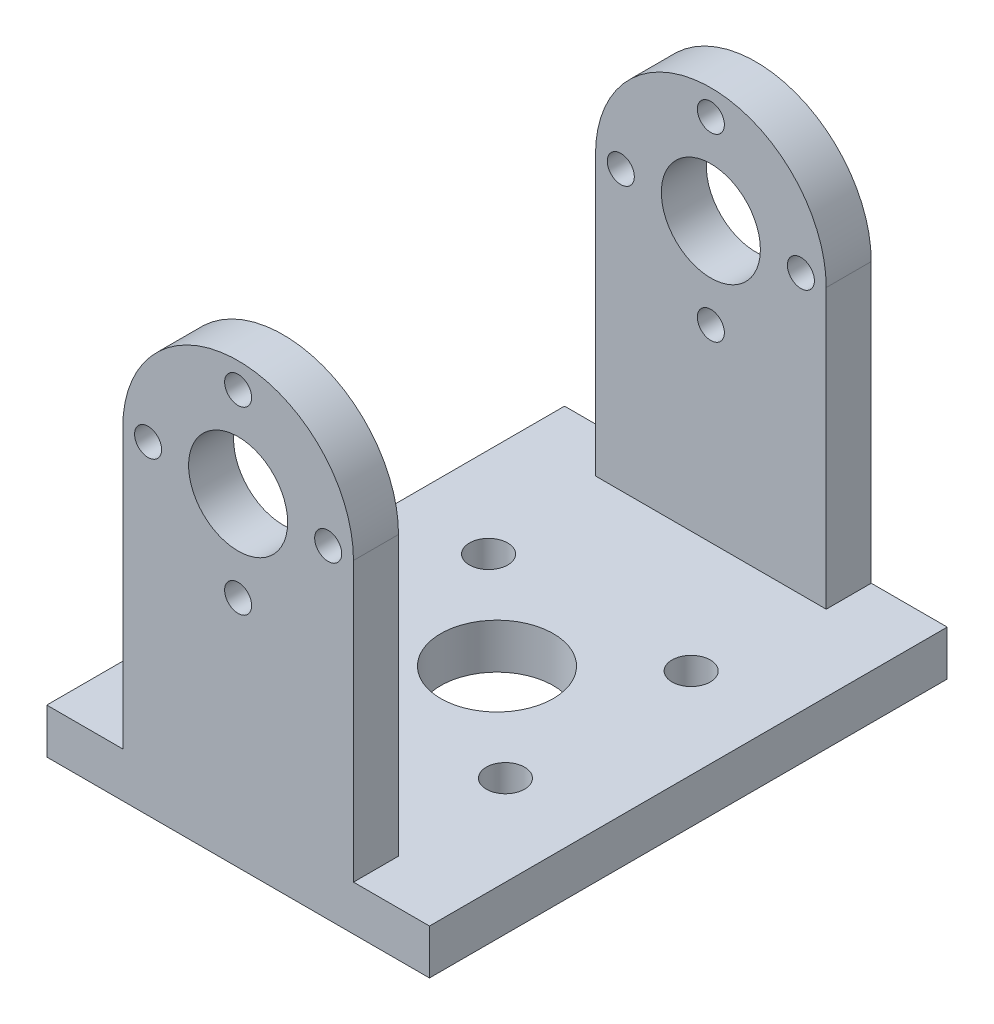
ISO-10303-21;
HEADER;
FILE_DESCRIPTION(('STEP AP214'),'2;1');
FILE_NAME('part.step','',(''),(''),'','','');
FILE_SCHEMA(('AUTOMOTIVE_DESIGN { 1 0 10303 214 1 1 1 1 }'));
ENDSEC;
DATA;
#1=APPLICATION_CONTEXT('core data for automotive mechanical design processes');
#2=APPLICATION_PROTOCOL_DEFINITION('international standard','automotive_design',2000,#1);
#3=PRODUCT_CONTEXT('',#1,'mechanical');
#4=PRODUCT('Part','Part','',(#3));
#5=PRODUCT_RELATED_PRODUCT_CATEGORY('part','',(#4));
#6=PRODUCT_DEFINITION_FORMATION('','',#4);
#7=PRODUCT_DEFINITION_CONTEXT('part definition',#1,'design');
#8=PRODUCT_DEFINITION('design','',#6,#7);
#9=PRODUCT_DEFINITION_SHAPE('','',#8);
#10=(LENGTH_UNIT() NAMED_UNIT(*) SI_UNIT(.MILLI.,.METRE.));
#11=(NAMED_UNIT(*) PLANE_ANGLE_UNIT() SI_UNIT($,.RADIAN.));
#12=(NAMED_UNIT(*) SI_UNIT($,.STERADIAN.) SOLID_ANGLE_UNIT());
#13=UNCERTAINTY_MEASURE_WITH_UNIT(LENGTH_MEASURE(1.E-05),#10,'distance_accuracy_value','');
#14=(GEOMETRIC_REPRESENTATION_CONTEXT(3) GLOBAL_UNCERTAINTY_ASSIGNED_CONTEXT((#13)) GLOBAL_UNIT_ASSIGNED_CONTEXT((#10,
#11,#12)) REPRESENTATION_CONTEXT('',''));
#15=CARTESIAN_POINT('',(0.,0.,0.));
#16=DIRECTION('',(0.,0.,1.));
#17=DIRECTION('',(1.,0.,0.));
#18=AXIS2_PLACEMENT_3D('',#15,#16,#17);
#19=CARTESIAN_POINT('',(0.,-24.75,0.));
#20=DIRECTION('',(0.,-1.,0.));
#21=DIRECTION('',(1.,0.,0.));
#22=AXIS2_PLACEMENT_3D('',#19,#20,#21);
#23=PLANE('',#22);
#24=CARTESIAN_POINT('',(0.,-24.75,23.));
#25=DIRECTION('',(0.,-1.,0.));
#26=DIRECTION('',(1.,0.,0.));
#27=AXIS2_PLACEMENT_3D('',#24,#25,#26);
#28=CIRCLE('',#27,5.);
#29=CARTESIAN_POINT('',(5.,-24.75,23.));
#30=VERTEX_POINT('',#29);
#31=EDGE_CURVE('E227',#30,#30,#28,.T.);
#32=ORIENTED_EDGE('',*,*,#31,.T.);
#33=EDGE_LOOP('',(#32));
#34=FACE_BOUND('',#33,.T.);
#35=CARTESIAN_POINT('',(9.,-24.75,14.75));
#36=DIRECTION('',(0.,-1.,0.));
#37=DIRECTION('',(1.,0.,0.));
#38=AXIS2_PLACEMENT_3D('',#35,#36,#37);
#39=CIRCLE('',#38,1.7);
#40=CARTESIAN_POINT('',(10.7,-24.75,14.75));
#41=VERTEX_POINT('',#40);
#42=EDGE_CURVE('E219',#41,#41,#39,.T.);
#43=ORIENTED_EDGE('',*,*,#42,.T.);
#44=EDGE_LOOP('',(#43));
#45=FACE_BOUND('',#44,.T.);
#46=CARTESIAN_POINT('',(-9.,-24.75,14.75));
#47=DIRECTION('',(0.,-1.,0.));
#48=DIRECTION('',(1.,0.,0.));
#49=AXIS2_PLACEMENT_3D('',#46,#47,#48);
#50=CIRCLE('',#49,1.7);
#51=CARTESIAN_POINT('',(-7.3,-24.75,14.75));
#52=VERTEX_POINT('',#51);
#53=EDGE_CURVE('E211',#52,#52,#50,.T.);
#54=ORIENTED_EDGE('',*,*,#53,.T.);
#55=EDGE_LOOP('',(#54));
#56=FACE_BOUND('',#55,.T.);
#57=CARTESIAN_POINT('',(-9.00000000000017,-24.75,31.25));
#58=DIRECTION('',(0.,-1.,0.));
#59=DIRECTION('',(1.,0.,0.));
#60=AXIS2_PLACEMENT_3D('',#57,#58,#59);
#61=CIRCLE('',#60,1.7);
#62=CARTESIAN_POINT('',(-7.30000000000017,-24.75,31.25));
#63=VERTEX_POINT('',#62);
#64=EDGE_CURVE('E203',#63,#63,#61,.T.);
#65=ORIENTED_EDGE('',*,*,#64,.T.);
#66=EDGE_LOOP('',(#65));
#67=FACE_BOUND('',#66,.T.);
#68=CARTESIAN_POINT('',(8.99999999999983,-24.75,31.25));
#69=DIRECTION('',(0.,-1.,0.));
#70=DIRECTION('',(1.,0.,0.));
#71=AXIS2_PLACEMENT_3D('',#68,#69,#70);
#72=CIRCLE('',#71,1.7);
#73=CARTESIAN_POINT('',(10.6999999999998,-24.75,31.25));
#74=VERTEX_POINT('',#73);
#75=EDGE_CURVE('E195',#74,#74,#72,.T.);
#76=ORIENTED_EDGE('',*,*,#75,.T.);
#77=EDGE_LOOP('',(#76));
#78=FACE_BOUND('',#77,.T.);
#79=DIRECTION('',(0.,0.,-1.));
#80=VECTOR('',#79,1.);
#81=CARTESIAN_POINT('',(10.25,-24.75,0.));
#82=LINE('',#81,#80);
#83=CARTESIAN_POINT('',(10.25,-24.75,46.));
#84=VERTEX_POINT('',#83);
#85=CARTESIAN_POINT('',(10.25,-24.75,42.));
#86=VERTEX_POINT('',#85);
#87=EDGE_CURVE('E11',#84,#86,#82,.T.);
#88=ORIENTED_EDGE('',*,*,#87,.F.);
#89=DIRECTION('',(-1.,0.,0.));
#90=VECTOR('',#89,1.);
#91=CARTESIAN_POINT('',(17.,-24.75,46.));
#92=LINE('',#91,#90);
#93=CARTESIAN_POINT('',(17.,-24.75,46.));
#94=VERTEX_POINT('',#93);
#95=EDGE_CURVE('E241',#94,#84,#92,.T.);
#96=ORIENTED_EDGE('',*,*,#95,.F.);
#97=DIRECTION('',(0.,0.,1.));
#98=VECTOR('',#97,1.);
#99=CARTESIAN_POINT('',(17.,-24.75,0.));
#100=LINE('',#99,#98);
#101=CARTESIAN_POINT('',(17.,-24.75,0.));
#102=VERTEX_POINT('',#101);
#103=EDGE_CURVE('E235',#102,#94,#100,.T.);
#104=ORIENTED_EDGE('',*,*,#103,.F.);
#105=DIRECTION('',(1.,0.,0.));
#106=VECTOR('',#105,1.);
#107=CARTESIAN_POINT('',(17.,-24.75,0.));
#108=LINE('',#107,#106);
#109=CARTESIAN_POINT('',(10.25,-24.75,0.));
#110=VERTEX_POINT('',#109);
#111=EDGE_CURVE('E249',#110,#102,#108,.T.);
#112=ORIENTED_EDGE('',*,*,#111,.F.);
#113=DIRECTION('',(0.,0.,-1.));
#114=VECTOR('',#113,1.);
#115=CARTESIAN_POINT('',(10.25,-24.75,4.));
#116=LINE('',#115,#114);
#117=CARTESIAN_POINT('',(10.25,-24.75,4.));
#118=VERTEX_POINT('',#117);
#119=EDGE_CURVE('E283',#118,#110,#116,.T.);
#120=ORIENTED_EDGE('',*,*,#119,.F.);
#121=DIRECTION('',(1.,0.,0.));
#122=VECTOR('',#121,1.);
#123=CARTESIAN_POINT('',(0.,-24.75,4.));
#124=LINE('',#123,#122);
#125=CARTESIAN_POINT('',(-10.25,-24.75,4.));
#126=VERTEX_POINT('',#125);
#127=EDGE_CURVE('E268',#126,#118,#124,.T.);
#128=ORIENTED_EDGE('',*,*,#127,.F.);
#129=DIRECTION('',(0.,0.,-1.));
#130=VECTOR('',#129,1.);
#131=CARTESIAN_POINT('',(-10.25,-24.75,4.));
#132=LINE('',#131,#130);
#133=CARTESIAN_POINT('',(-10.25,-24.75,0.));
#134=VERTEX_POINT('',#133);
#135=EDGE_CURVE('E71',#126,#134,#132,.T.);
#136=ORIENTED_EDGE('',*,*,#135,.T.);
#137=CARTESIAN_POINT('',(-17.,-24.75,0.));
#138=VERTEX_POINT('',#137);
#139=EDGE_CURVE('E250',#138,#134,#108,.T.);
#140=ORIENTED_EDGE('',*,*,#139,.F.);
#141=DIRECTION('',(0.,0.,-1.));
#142=VECTOR('',#141,1.);
#143=CARTESIAN_POINT('',(-17.,-24.75,0.));
#144=LINE('',#143,#142);
#145=CARTESIAN_POINT('',(-17.,-24.75,46.));
#146=VERTEX_POINT('',#145);
#147=EDGE_CURVE('E245',#146,#138,#144,.T.);
#148=ORIENTED_EDGE('',*,*,#147,.F.);
#149=CARTESIAN_POINT('',(-10.25,-24.75,46.));
#150=VERTEX_POINT('',#149);
#151=EDGE_CURVE('E239',#150,#146,#92,.T.);
#152=ORIENTED_EDGE('',*,*,#151,.F.);
#153=DIRECTION('',(0.,0.,-1.));
#154=VECTOR('',#153,1.);
#155=CARTESIAN_POINT('',(-10.25,-24.75,0.));
#156=LINE('',#155,#154);
#157=CARTESIAN_POINT('',(-10.25,-24.75,42.));
#158=VERTEX_POINT('',#157);
#159=EDGE_CURVE('E56',#150,#158,#156,.T.);
#160=ORIENTED_EDGE('',*,*,#159,.T.);
#161=DIRECTION('',(1.,0.,0.));
#162=VECTOR('',#161,1.);
#163=CARTESIAN_POINT('',(0.,-24.75,42.));
#164=LINE('',#163,#162);
#165=EDGE_CURVE('E154',#158,#86,#164,.T.);
#166=ORIENTED_EDGE('',*,*,#165,.T.);
#167=EDGE_LOOP('',(#88,#96,#104,#112,#120,#128,#136,#140,#148,#152,#160,#166));
#168=FACE_BOUND('',#167,.T.);
#169=ADVANCED_FACE('F47',(#34,#45,#56,#67,#78,#168),#23,.F.);
#170=CARTESIAN_POINT('',(10.25,0.,4.));
#171=DIRECTION('',(1.,0.,0.));
#172=DIRECTION('',(0.,1.,0.));
#173=AXIS2_PLACEMENT_3D('',#170,#171,#172);
#174=PLANE('',#173);
#175=DIRECTION('',(0.,-1.,0.));
#176=VECTOR('',#175,1.);
#177=CARTESIAN_POINT('',(10.25,0.,4.));
#178=LINE('',#177,#176);
#179=CARTESIAN_POINT('',(10.25,0.,4.));
#180=VERTEX_POINT('',#179);
#181=EDGE_CURVE('E308',#180,#118,#178,.T.);
#182=ORIENTED_EDGE('',*,*,#181,.T.);
#183=ORIENTED_EDGE('',*,*,#119,.T.);
#184=DIRECTION('',(0.,-1.,0.));
#185=VECTOR('',#184,1.);
#186=CARTESIAN_POINT('',(10.25,0.,0.));
#187=LINE('',#186,#185);
#188=CARTESIAN_POINT('',(10.25,0.,0.));
#189=VERTEX_POINT('',#188);
#190=EDGE_CURVE('E339',#189,#110,#187,.T.);
#191=ORIENTED_EDGE('',*,*,#190,.F.);
#192=DIRECTION('',(0.,0.,-1.));
#193=VECTOR('',#192,1.);
#194=CARTESIAN_POINT('',(10.25,0.,4.));
#195=LINE('',#194,#193);
#196=EDGE_CURVE('E355',#180,#189,#195,.T.);
#197=ORIENTED_EDGE('',*,*,#196,.F.);
#198=EDGE_LOOP('',(#182,#183,#191,#197));
#199=FACE_BOUND('',#198,.T.);
#200=ADVANCED_FACE('F399',(#199),#174,.T.);
#201=CARTESIAN_POINT('',(-10.25,0.,4.));
#202=DIRECTION('',(1.,0.,0.));
#203=DIRECTION('',(0.,1.,0.));
#204=AXIS2_PLACEMENT_3D('',#201,#202,#203);
#205=PLANE('',#204);
#206=ORIENTED_EDGE('',*,*,#135,.F.);
#207=DIRECTION('',(0.,-1.,0.));
#208=VECTOR('',#207,1.);
#209=CARTESIAN_POINT('',(-10.25,0.,4.));
#210=LINE('',#209,#208);
#211=CARTESIAN_POINT('',(-10.25,0.,4.));
#212=VERTEX_POINT('',#211);
#213=EDGE_CURVE('E316',#212,#126,#210,.T.);
#214=ORIENTED_EDGE('',*,*,#213,.F.);
#215=DIRECTION('',(0.,0.,-1.));
#216=VECTOR('',#215,1.);
#217=CARTESIAN_POINT('',(-10.25,0.,4.));
#218=LINE('',#217,#216);
#219=CARTESIAN_POINT('',(-10.25,0.,0.));
#220=VERTEX_POINT('',#219);
#221=EDGE_CURVE('E319',#212,#220,#218,.T.);
#222=ORIENTED_EDGE('',*,*,#221,.T.);
#223=DIRECTION('',(0.,-1.,0.));
#224=VECTOR('',#223,1.);
#225=CARTESIAN_POINT('',(-10.25,0.,0.));
#226=LINE('',#225,#224);
#227=EDGE_CURVE('E347',#220,#134,#226,.T.);
#228=ORIENTED_EDGE('',*,*,#227,.T.);
#229=EDGE_LOOP('',(#206,#214,#222,#228));
#230=FACE_BOUND('',#229,.T.);
#231=ADVANCED_FACE('F393',(#230),#205,.F.);
#232=CARTESIAN_POINT('',(0.,0.,4.));
#233=DIRECTION('',(0.,0.,1.));
#234=DIRECTION('',(1.,0.,0.));
#235=AXIS2_PLACEMENT_3D('',#232,#233,#234);
#236=PLANE('',#235);
#237=CARTESIAN_POINT('',(0.,-8.,4.));
#238=DIRECTION('',(0.,0.,1.));
#239=DIRECTION('',(1.,0.,0.));
#240=AXIS2_PLACEMENT_3D('',#237,#238,#239);
#241=CIRCLE('',#240,1.2);
#242=CARTESIAN_POINT('',(1.19999999999994,-8.,4.));
#243=VERTEX_POINT('',#242);
#244=EDGE_CURVE('E287',#243,#243,#241,.T.);
#245=ORIENTED_EDGE('',*,*,#244,.F.);
#246=EDGE_LOOP('',(#245));
#247=FACE_BOUND('',#246,.T.);
#248=CARTESIAN_POINT('',(8.,0.,4.));
#249=DIRECTION('',(0.,0.,1.));
#250=DIRECTION('',(1.,0.,0.));
#251=AXIS2_PLACEMENT_3D('',#248,#249,#250);
#252=CIRCLE('',#251,1.2);
#253=CARTESIAN_POINT('',(9.2,0.,4.));
#254=VERTEX_POINT('',#253);
#255=EDGE_CURVE('E291',#254,#254,#252,.T.);
#256=ORIENTED_EDGE('',*,*,#255,.F.);
#257=EDGE_LOOP('',(#256));
#258=FACE_BOUND('',#257,.T.);
#259=CARTESIAN_POINT('',(0.,8.,4.));
#260=DIRECTION('',(0.,0.,1.));
#261=DIRECTION('',(1.,0.,0.));
#262=AXIS2_PLACEMENT_3D('',#259,#260,#261);
#263=CIRCLE('',#262,1.2);
#264=CARTESIAN_POINT('',(1.2,8.,4.));
#265=VERTEX_POINT('',#264);
#266=EDGE_CURVE('E296',#265,#265,#263,.T.);
#267=ORIENTED_EDGE('',*,*,#266,.F.);
#268=EDGE_LOOP('',(#267));
#269=FACE_BOUND('',#268,.T.);
#270=CARTESIAN_POINT('',(0.,0.,4.));
#271=DIRECTION('',(0.,0.,1.));
#272=DIRECTION('',(1.,0.,0.));
#273=AXIS2_PLACEMENT_3D('',#270,#271,#272);
#274=CIRCLE('',#273,4.4);
#275=CARTESIAN_POINT('',(4.4,0.,4.));
#276=VERTEX_POINT('',#275);
#277=EDGE_CURVE('E300',#276,#276,#274,.T.);
#278=ORIENTED_EDGE('',*,*,#277,.F.);
#279=EDGE_LOOP('',(#278));
#280=FACE_BOUND('',#279,.T.);
#281=CARTESIAN_POINT('',(-8.,0.,4.));
#282=DIRECTION('',(0.,0.,1.));
#283=DIRECTION('',(1.,0.,0.));
#284=AXIS2_PLACEMENT_3D('',#281,#282,#283);
#285=CIRCLE('',#284,1.2);
#286=CARTESIAN_POINT('',(-6.8,0.,4.));
#287=VERTEX_POINT('',#286);
#288=EDGE_CURVE('E304',#287,#287,#285,.T.);
#289=ORIENTED_EDGE('',*,*,#288,.F.);
#290=EDGE_LOOP('',(#289));
#291=FACE_BOUND('',#290,.T.);
#292=ORIENTED_EDGE('',*,*,#213,.T.);
#293=ORIENTED_EDGE('',*,*,#127,.T.);
#294=ORIENTED_EDGE('',*,*,#181,.F.);
#295=CARTESIAN_POINT('',(0.,0.,4.));
#296=DIRECTION('',(0.,0.,1.));
#297=DIRECTION('',(1.,0.,0.));
#298=AXIS2_PLACEMENT_3D('',#295,#296,#297);
#299=CIRCLE('',#298,10.25);
#300=EDGE_CURVE('E312',#180,#212,#299,.T.);
#301=ORIENTED_EDGE('',*,*,#300,.T.);
#302=EDGE_LOOP('',(#292,#293,#294,#301));
#303=FACE_BOUND('',#302,.T.);
#304=ADVANCED_FACE('F401',(#247,#258,#269,#280,#291,#303),#236,.T.);
#305=CARTESIAN_POINT('',(0.,0.,4.));
#306=DIRECTION('',(0.,0.,-1.));
#307=DIRECTION('',(-1.,0.,0.));
#308=AXIS2_PLACEMENT_3D('',#305,#306,#307);
#309=CYLINDRICAL_SURFACE('',#308,10.25);
#310=CARTESIAN_POINT('',(0.,0.,0.));
#311=DIRECTION('',(0.,0.,1.));
#312=DIRECTION('',(1.,0.,0.));
#313=AXIS2_PLACEMENT_3D('',#310,#311,#312);
#314=CIRCLE('',#313,10.25);
#315=EDGE_CURVE('E343',#189,#220,#314,.T.);
#316=ORIENTED_EDGE('',*,*,#315,.T.);
#317=ORIENTED_EDGE('',*,*,#221,.F.);
#318=ORIENTED_EDGE('',*,*,#300,.F.);
#319=ORIENTED_EDGE('',*,*,#196,.T.);
#320=EDGE_LOOP('',(#316,#317,#318,#319));
#321=FACE_BOUND('',#320,.T.);
#322=ADVANCED_FACE('F396',(#321),#309,.T.);
#323=CARTESIAN_POINT('',(-8.,0.,4.));
#324=DIRECTION('',(0.,0.,-1.));
#325=DIRECTION('',(-1.,0.,0.));
#326=AXIS2_PLACEMENT_3D('',#323,#324,#325);
#327=CYLINDRICAL_SURFACE('',#326,1.2);
#328=ORIENTED_EDGE('',*,*,#288,.T.);
#329=EDGE_LOOP('',(#328));
#330=FACE_BOUND('',#329,.T.);
#331=CARTESIAN_POINT('',(-8.,0.,0.));
#332=DIRECTION('',(0.,0.,1.));
#333=DIRECTION('',(1.,0.,0.));
#334=AXIS2_PLACEMENT_3D('',#331,#332,#333);
#335=CIRCLE('',#334,1.2);
#336=CARTESIAN_POINT('',(-6.8,0.,0.));
#337=VERTEX_POINT('',#336);
#338=EDGE_CURVE('E335',#337,#337,#335,.T.);
#339=ORIENTED_EDGE('',*,*,#338,.F.);
#340=EDGE_LOOP('',(#339));
#341=FACE_BOUND('',#340,.T.);
#342=ADVANCED_FACE('F410',(#330,#341),#327,.F.);
#343=CARTESIAN_POINT('',(0.,0.,4.));
#344=DIRECTION('',(0.,0.,-1.));
#345=DIRECTION('',(-1.,0.,0.));
#346=AXIS2_PLACEMENT_3D('',#343,#344,#345);
#347=CYLINDRICAL_SURFACE('',#346,4.4);
#348=ORIENTED_EDGE('',*,*,#277,.T.);
#349=EDGE_LOOP('',(#348));
#350=FACE_BOUND('',#349,.T.);
#351=CARTESIAN_POINT('',(0.,0.,0.));
#352=DIRECTION('',(0.,0.,1.));
#353=DIRECTION('',(1.,0.,0.));
#354=AXIS2_PLACEMENT_3D('',#351,#352,#353);
#355=CIRCLE('',#354,4.4);
#356=CARTESIAN_POINT('',(4.4,0.,0.));
#357=VERTEX_POINT('',#356);
#358=EDGE_CURVE('E331',#357,#357,#355,.T.);
#359=ORIENTED_EDGE('',*,*,#358,.F.);
#360=EDGE_LOOP('',(#359));
#361=FACE_BOUND('',#360,.T.);
#362=ADVANCED_FACE('F443',(#350,#361),#347,.F.);
#363=CARTESIAN_POINT('',(0.,8.,4.));
#364=DIRECTION('',(0.,0.,-1.));
#365=DIRECTION('',(-1.,0.,0.));
#366=AXIS2_PLACEMENT_3D('',#363,#364,#365);
#367=CYLINDRICAL_SURFACE('',#366,1.2);
#368=ORIENTED_EDGE('',*,*,#266,.T.);
#369=EDGE_LOOP('',(#368));
#370=FACE_BOUND('',#369,.T.);
#371=CARTESIAN_POINT('',(0.,8.,0.));
#372=DIRECTION('',(0.,0.,1.));
#373=DIRECTION('',(1.,0.,0.));
#374=AXIS2_PLACEMENT_3D('',#371,#372,#373);
#375=CIRCLE('',#374,1.2);
#376=CARTESIAN_POINT('',(1.2,8.,0.));
#377=VERTEX_POINT('',#376);
#378=EDGE_CURVE('E327',#377,#377,#375,.T.);
#379=ORIENTED_EDGE('',*,*,#378,.F.);
#380=EDGE_LOOP('',(#379));
#381=FACE_BOUND('',#380,.T.);
#382=ADVANCED_FACE('F447',(#370,#381),#367,.F.);
#383=CARTESIAN_POINT('',(8.,0.,4.));
#384=DIRECTION('',(0.,0.,-1.));
#385=DIRECTION('',(-1.,0.,0.));
#386=AXIS2_PLACEMENT_3D('',#383,#384,#385);
#387=CYLINDRICAL_SURFACE('',#386,1.2);
#388=ORIENTED_EDGE('',*,*,#255,.T.);
#389=EDGE_LOOP('',(#388));
#390=FACE_BOUND('',#389,.T.);
#391=CARTESIAN_POINT('',(8.,0.,0.));
#392=DIRECTION('',(0.,0.,1.));
#393=DIRECTION('',(1.,0.,0.));
#394=AXIS2_PLACEMENT_3D('',#391,#392,#393);
#395=CIRCLE('',#394,1.2);
#396=CARTESIAN_POINT('',(9.2,0.,0.));
#397=VERTEX_POINT('',#396);
#398=EDGE_CURVE('E323',#397,#397,#395,.T.);
#399=ORIENTED_EDGE('',*,*,#398,.F.);
#400=EDGE_LOOP('',(#399));
#401=FACE_BOUND('',#400,.T.);
#402=ADVANCED_FACE('F450',(#390,#401),#387,.F.);
#403=CARTESIAN_POINT('',(0.,-8.,4.));
#404=DIRECTION('',(0.,0.,-1.));
#405=DIRECTION('',(-1.,0.,0.));
#406=AXIS2_PLACEMENT_3D('',#403,#404,#405);
#407=CYLINDRICAL_SURFACE('',#406,1.2);
#408=ORIENTED_EDGE('',*,*,#244,.T.);
#409=EDGE_LOOP('',(#408));
#410=FACE_BOUND('',#409,.T.);
#411=CARTESIAN_POINT('',(0.,-8.,0.));
#412=DIRECTION('',(0.,0.,1.));
#413=DIRECTION('',(1.,0.,0.));
#414=AXIS2_PLACEMENT_3D('',#411,#412,#413);
#415=CIRCLE('',#414,1.2);
#416=CARTESIAN_POINT('',(1.19999999999994,-8.,0.));
#417=VERTEX_POINT('',#416);
#418=EDGE_CURVE('E286',#417,#417,#415,.T.);
#419=ORIENTED_EDGE('',*,*,#418,.F.);
#420=EDGE_LOOP('',(#419));
#421=FACE_BOUND('',#420,.T.);
#422=ADVANCED_FACE('F49',(#410,#421),#407,.F.);
#423=CARTESIAN_POINT('',(0.,-28.75,4.));
#424=DIRECTION('',(0.,1.,0.));
#425=DIRECTION('',(-1.,0.,0.));
#426=AXIS2_PLACEMENT_3D('',#423,#424,#425);
#427=PLANE('',#426);
#428=DIRECTION('',(-1.,0.,0.));
#429=VECTOR('',#428,1.);
#430=CARTESIAN_POINT('',(17.,-28.75,46.));
#431=LINE('',#430,#429);
#432=CARTESIAN_POINT('',(17.,-28.75,46.));
#433=VERTEX_POINT('',#432);
#434=CARTESIAN_POINT('',(-17.,-28.75,46.));
#435=VERTEX_POINT('',#434);
#436=EDGE_CURVE('E258',#433,#435,#431,.T.);
#437=ORIENTED_EDGE('',*,*,#436,.T.);
#438=DIRECTION('',(0.,0.,-1.));
#439=VECTOR('',#438,1.);
#440=CARTESIAN_POINT('',(-17.,-28.75,0.));
#441=LINE('',#440,#439);
#442=CARTESIAN_POINT('',(-17.,-28.75,0.));
#443=VERTEX_POINT('',#442);
#444=EDGE_CURVE('E240',#435,#443,#441,.T.);
#445=ORIENTED_EDGE('',*,*,#444,.T.);
#446=DIRECTION('',(1.,0.,0.));
#447=VECTOR('',#446,1.);
#448=CARTESIAN_POINT('',(0.,-28.75,0.));
#449=LINE('',#448,#447);
#450=CARTESIAN_POINT('',(17.,-28.75,0.));
#451=VERTEX_POINT('',#450);
#452=EDGE_CURVE('E292',#443,#451,#449,.T.);
#453=ORIENTED_EDGE('',*,*,#452,.T.);
#454=DIRECTION('',(0.,0.,1.));
#455=VECTOR('',#454,1.);
#456=CARTESIAN_POINT('',(17.,-28.75,0.));
#457=LINE('',#456,#455);
#458=EDGE_CURVE('E231',#451,#433,#457,.T.);
#459=ORIENTED_EDGE('',*,*,#458,.T.);
#460=EDGE_LOOP('',(#437,#445,#453,#459));
#461=FACE_BOUND('',#460,.T.);
#462=CARTESIAN_POINT('',(0.,-28.75,23.));
#463=DIRECTION('',(0.,-1.,0.));
#464=DIRECTION('',(1.,0.,0.));
#465=AXIS2_PLACEMENT_3D('',#462,#463,#464);
#466=CIRCLE('',#465,5.);
#467=CARTESIAN_POINT('',(5.,-28.75,23.));
#468=VERTEX_POINT('',#467);
#469=EDGE_CURVE('E223',#468,#468,#466,.T.);
#470=ORIENTED_EDGE('',*,*,#469,.F.);
#471=EDGE_LOOP('',(#470));
#472=FACE_BOUND('',#471,.T.);
#473=CARTESIAN_POINT('',(9.,-28.75,14.75));
#474=DIRECTION('',(0.,-1.,0.));
#475=DIRECTION('',(1.,0.,0.));
#476=AXIS2_PLACEMENT_3D('',#473,#474,#475);
#477=CIRCLE('',#476,1.7);
#478=CARTESIAN_POINT('',(10.7,-28.75,14.75));
#479=VERTEX_POINT('',#478);
#480=EDGE_CURVE('E215',#479,#479,#477,.T.);
#481=ORIENTED_EDGE('',*,*,#480,.F.);
#482=EDGE_LOOP('',(#481));
#483=FACE_BOUND('',#482,.T.);
#484=CARTESIAN_POINT('',(-9.,-28.75,14.75));
#485=DIRECTION('',(0.,-1.,0.));
#486=DIRECTION('',(1.,0.,0.));
#487=AXIS2_PLACEMENT_3D('',#484,#485,#486);
#488=CIRCLE('',#487,1.7);
#489=CARTESIAN_POINT('',(-7.3,-28.75,14.75));
#490=VERTEX_POINT('',#489);
#491=EDGE_CURVE('E207',#490,#490,#488,.T.);
#492=ORIENTED_EDGE('',*,*,#491,.F.);
#493=EDGE_LOOP('',(#492));
#494=FACE_BOUND('',#493,.T.);
#495=CARTESIAN_POINT('',(-9.00000000000017,-28.75,31.25));
#496=DIRECTION('',(0.,-1.,0.));
#497=DIRECTION('',(1.,0.,0.));
#498=AXIS2_PLACEMENT_3D('',#495,#496,#497);
#499=CIRCLE('',#498,1.7);
#500=CARTESIAN_POINT('',(-7.30000000000017,-28.75,31.25));
#501=VERTEX_POINT('',#500);
#502=EDGE_CURVE('E199',#501,#501,#499,.T.);
#503=ORIENTED_EDGE('',*,*,#502,.F.);
#504=EDGE_LOOP('',(#503));
#505=FACE_BOUND('',#504,.T.);
#506=CARTESIAN_POINT('',(8.99999999999983,-28.75,31.25));
#507=DIRECTION('',(0.,-1.,0.));
#508=DIRECTION('',(1.,0.,0.));
#509=AXIS2_PLACEMENT_3D('',#506,#507,#508);
#510=CIRCLE('',#509,1.7);
#511=CARTESIAN_POINT('',(10.6999999999998,-28.75,31.25));
#512=VERTEX_POINT('',#511);
#513=EDGE_CURVE('E145',#512,#512,#510,.T.);
#514=ORIENTED_EDGE('',*,*,#513,.F.);
#515=EDGE_LOOP('',(#514));
#516=FACE_BOUND('',#515,.T.);
#517=ADVANCED_FACE('F387',(#461,#472,#483,#494,#505,#516),#427,.F.);
#518=CARTESIAN_POINT('',(0.,0.,0.));
#519=DIRECTION('',(0.,0.,1.));
#520=DIRECTION('',(1.,0.,0.));
#521=AXIS2_PLACEMENT_3D('',#518,#519,#520);
#522=PLANE('',#521);
#523=ORIENTED_EDGE('',*,*,#452,.F.);
#524=DIRECTION('',(0.,-1.,0.));
#525=VECTOR('',#524,1.);
#526=CARTESIAN_POINT('',(-17.,-24.75,0.));
#527=LINE('',#526,#525);
#528=EDGE_CURVE('E269',#138,#443,#527,.T.);
#529=ORIENTED_EDGE('',*,*,#528,.F.);
#530=ORIENTED_EDGE('',*,*,#139,.T.);
#531=ORIENTED_EDGE('',*,*,#227,.F.);
#532=ORIENTED_EDGE('',*,*,#315,.F.);
#533=ORIENTED_EDGE('',*,*,#190,.T.);
#534=ORIENTED_EDGE('',*,*,#111,.T.);
#535=DIRECTION('',(0.,-1.,0.));
#536=VECTOR('',#535,1.);
#537=CARTESIAN_POINT('',(17.,-24.75,0.));
#538=LINE('',#537,#536);
#539=EDGE_CURVE('E264',#102,#451,#538,.T.);
#540=ORIENTED_EDGE('',*,*,#539,.T.);
#541=EDGE_LOOP('',(#523,#529,#530,#531,#532,#533,#534,#540));
#542=FACE_BOUND('',#541,.T.);
#543=ORIENTED_EDGE('',*,*,#338,.T.);
#544=EDGE_LOOP('',(#543));
#545=FACE_BOUND('',#544,.T.);
#546=ORIENTED_EDGE('',*,*,#358,.T.);
#547=EDGE_LOOP('',(#546));
#548=FACE_BOUND('',#547,.T.);
#549=ORIENTED_EDGE('',*,*,#378,.T.);
#550=EDGE_LOOP('',(#549));
#551=FACE_BOUND('',#550,.T.);
#552=ORIENTED_EDGE('',*,*,#398,.T.);
#553=EDGE_LOOP('',(#552));
#554=FACE_BOUND('',#553,.T.);
#555=ORIENTED_EDGE('',*,*,#418,.T.);
#556=EDGE_LOOP('',(#555));
#557=FACE_BOUND('',#556,.T.);
#558=ADVANCED_FACE('F371',(#542,#545,#548,#551,#554,#557),#522,.F.);
#559=CARTESIAN_POINT('',(17.,-24.75,0.));
#560=DIRECTION('',(1.,0.,0.));
#561=DIRECTION('',(0.,0.,-1.));
#562=AXIS2_PLACEMENT_3D('',#559,#560,#561);
#563=PLANE('',#562);
#564=ORIENTED_EDGE('',*,*,#458,.F.);
#565=ORIENTED_EDGE('',*,*,#539,.F.);
#566=ORIENTED_EDGE('',*,*,#103,.T.);
#567=DIRECTION('',(0.,-1.,0.));
#568=VECTOR('',#567,1.);
#569=CARTESIAN_POINT('',(17.,-24.75,46.));
#570=LINE('',#569,#568);
#571=EDGE_CURVE('E254',#94,#433,#570,.T.);
#572=ORIENTED_EDGE('',*,*,#571,.T.);
#573=EDGE_LOOP('',(#564,#565,#566,#572));
#574=FACE_BOUND('',#573,.T.);
#575=ADVANCED_FACE('F379',(#574),#563,.T.);
#576=CARTESIAN_POINT('',(-17.,-24.75,0.));
#577=DIRECTION('',(-1.,0.,0.));
#578=DIRECTION('',(0.,0.,1.));
#579=AXIS2_PLACEMENT_3D('',#576,#577,#578);
#580=PLANE('',#579);
#581=ORIENTED_EDGE('',*,*,#444,.F.);
#582=DIRECTION('',(0.,-1.,0.));
#583=VECTOR('',#582,1.);
#584=CARTESIAN_POINT('',(-17.,-24.75,46.));
#585=LINE('',#584,#583);
#586=EDGE_CURVE('E273',#146,#435,#585,.T.);
#587=ORIENTED_EDGE('',*,*,#586,.F.);
#588=ORIENTED_EDGE('',*,*,#147,.T.);
#589=ORIENTED_EDGE('',*,*,#528,.T.);
#590=EDGE_LOOP('',(#581,#587,#588,#589));
#591=FACE_BOUND('',#590,.T.);
#592=ADVANCED_FACE('F390',(#591),#580,.T.);
#593=CARTESIAN_POINT('',(17.,-24.75,46.));
#594=DIRECTION('',(0.,0.,1.));
#595=DIRECTION('',(1.,0.,0.));
#596=AXIS2_PLACEMENT_3D('',#593,#594,#595);
#597=PLANE('',#596);
#598=ORIENTED_EDGE('',*,*,#586,.T.);
#599=ORIENTED_EDGE('',*,*,#436,.F.);
#600=ORIENTED_EDGE('',*,*,#571,.F.);
#601=ORIENTED_EDGE('',*,*,#95,.T.);
#602=DIRECTION('',(0.,-1.,0.));
#603=VECTOR('',#602,1.);
#604=CARTESIAN_POINT('',(10.25,0.,46.));
#605=LINE('',#604,#603);
#606=CARTESIAN_POINT('',(10.25,0.,46.));
#607=VERTEX_POINT('',#606);
#608=EDGE_CURVE('E186',#607,#84,#605,.T.);
#609=ORIENTED_EDGE('',*,*,#608,.F.);
#610=CARTESIAN_POINT('',(0.,0.,46.));
#611=DIRECTION('',(0.,0.,1.));
#612=DIRECTION('',(1.,0.,0.));
#613=AXIS2_PLACEMENT_3D('',#610,#611,#612);
#614=CIRCLE('',#613,10.25);
#615=CARTESIAN_POINT('',(-10.25,0.,46.));
#616=VERTEX_POINT('',#615);
#617=EDGE_CURVE('E191',#607,#616,#614,.T.);
#618=ORIENTED_EDGE('',*,*,#617,.T.);
#619=DIRECTION('',(0.,-1.,0.));
#620=VECTOR('',#619,1.);
#621=CARTESIAN_POINT('',(-10.25,0.,46.));
#622=LINE('',#621,#620);
#623=EDGE_CURVE('E63',#616,#150,#622,.T.);
#624=ORIENTED_EDGE('',*,*,#623,.T.);
#625=ORIENTED_EDGE('',*,*,#151,.T.);
#626=EDGE_LOOP('',(#598,#599,#600,#601,#609,#618,#624,#625));
#627=FACE_BOUND('',#626,.T.);
#628=CARTESIAN_POINT('',(0.,-8.,46.));
#629=DIRECTION('',(0.,0.,1.));
#630=DIRECTION('',(1.,0.,0.));
#631=AXIS2_PLACEMENT_3D('',#628,#629,#630);
#632=CIRCLE('',#631,1.2);
#633=CARTESIAN_POINT('',(1.19999999999994,-8.,46.));
#634=VERTEX_POINT('',#633);
#635=EDGE_CURVE('E166',#634,#634,#632,.T.);
#636=ORIENTED_EDGE('',*,*,#635,.F.);
#637=EDGE_LOOP('',(#636));
#638=FACE_BOUND('',#637,.T.);
#639=CARTESIAN_POINT('',(8.,0.,46.));
#640=DIRECTION('',(0.,0.,1.));
#641=DIRECTION('',(1.,0.,0.));
#642=AXIS2_PLACEMENT_3D('',#639,#640,#641);
#643=CIRCLE('',#642,1.2);
#644=CARTESIAN_POINT('',(9.2,0.,46.));
#645=VERTEX_POINT('',#644);
#646=EDGE_CURVE('E170',#645,#645,#643,.T.);
#647=ORIENTED_EDGE('',*,*,#646,.F.);
#648=EDGE_LOOP('',(#647));
#649=FACE_BOUND('',#648,.T.);
#650=CARTESIAN_POINT('',(0.,8.,46.));
#651=DIRECTION('',(0.,0.,1.));
#652=DIRECTION('',(1.,0.,0.));
#653=AXIS2_PLACEMENT_3D('',#650,#651,#652);
#654=CIRCLE('',#653,1.2);
#655=CARTESIAN_POINT('',(1.2,8.,46.));
#656=VERTEX_POINT('',#655);
#657=EDGE_CURVE('E174',#656,#656,#654,.T.);
#658=ORIENTED_EDGE('',*,*,#657,.F.);
#659=EDGE_LOOP('',(#658));
#660=FACE_BOUND('',#659,.T.);
#661=CARTESIAN_POINT('',(0.,0.,46.));
#662=DIRECTION('',(0.,0.,1.));
#663=DIRECTION('',(1.,0.,0.));
#664=AXIS2_PLACEMENT_3D('',#661,#662,#663);
#665=CIRCLE('',#664,4.4);
#666=CARTESIAN_POINT('',(4.4,0.,46.));
#667=VERTEX_POINT('',#666);
#668=EDGE_CURVE('E178',#667,#667,#665,.T.);
#669=ORIENTED_EDGE('',*,*,#668,.F.);
#670=EDGE_LOOP('',(#669));
#671=FACE_BOUND('',#670,.T.);
#672=CARTESIAN_POINT('',(-8.,0.,46.));
#673=DIRECTION('',(0.,0.,1.));
#674=DIRECTION('',(1.,0.,0.));
#675=AXIS2_PLACEMENT_3D('',#672,#673,#674);
#676=CIRCLE('',#675,1.2);
#677=CARTESIAN_POINT('',(-6.8,0.,46.));
#678=VERTEX_POINT('',#677);
#679=EDGE_CURVE('E182',#678,#678,#676,.T.);
#680=ORIENTED_EDGE('',*,*,#679,.F.);
#681=EDGE_LOOP('',(#680));
#682=FACE_BOUND('',#681,.T.);
#683=ADVANCED_FACE('F382',(#627,#638,#649,#660,#671,#682),#597,.T.);
#684=CARTESIAN_POINT('',(0.,-24.75,23.));
#685=DIRECTION('',(0.,-1.,0.));
#686=DIRECTION('',(1.,0.,0.));
#687=AXIS2_PLACEMENT_3D('',#684,#685,#686);
#688=CYLINDRICAL_SURFACE('',#687,5.);
#689=ORIENTED_EDGE('',*,*,#31,.F.);
#690=EDGE_LOOP('',(#689));
#691=FACE_BOUND('',#690,.T.);
#692=ORIENTED_EDGE('',*,*,#469,.T.);
#693=EDGE_LOOP('',(#692));
#694=FACE_BOUND('',#693,.T.);
#695=ADVANCED_FACE('F429',(#691,#694),#688,.F.);
#696=CARTESIAN_POINT('',(9.,-24.75,14.75));
#697=DIRECTION('',(0.,-1.,0.));
#698=DIRECTION('',(1.,0.,0.));
#699=AXIS2_PLACEMENT_3D('',#696,#697,#698);
#700=CYLINDRICAL_SURFACE('',#699,1.7);
#701=ORIENTED_EDGE('',*,*,#42,.F.);
#702=EDGE_LOOP('',(#701));
#703=FACE_BOUND('',#702,.T.);
#704=ORIENTED_EDGE('',*,*,#480,.T.);
#705=EDGE_LOOP('',(#704));
#706=FACE_BOUND('',#705,.T.);
#707=ADVANCED_FACE('F575',(#703,#706),#700,.F.);
#708=CARTESIAN_POINT('',(-9.,-24.75,14.75));
#709=DIRECTION('',(0.,-1.,0.));
#710=DIRECTION('',(1.,0.,0.));
#711=AXIS2_PLACEMENT_3D('',#708,#709,#710);
#712=CYLINDRICAL_SURFACE('',#711,1.7);
#713=ORIENTED_EDGE('',*,*,#53,.F.);
#714=EDGE_LOOP('',(#713));
#715=FACE_BOUND('',#714,.T.);
#716=ORIENTED_EDGE('',*,*,#491,.T.);
#717=EDGE_LOOP('',(#716));
#718=FACE_BOUND('',#717,.T.);
#719=ADVANCED_FACE('F584',(#715,#718),#712,.F.);
#720=CARTESIAN_POINT('',(-9.00000000000017,-24.75,31.25));
#721=DIRECTION('',(0.,-1.,0.));
#722=DIRECTION('',(1.,0.,0.));
#723=AXIS2_PLACEMENT_3D('',#720,#721,#722);
#724=CYLINDRICAL_SURFACE('',#723,1.7);
#725=ORIENTED_EDGE('',*,*,#64,.F.);
#726=EDGE_LOOP('',(#725));
#727=FACE_BOUND('',#726,.T.);
#728=ORIENTED_EDGE('',*,*,#502,.T.);
#729=EDGE_LOOP('',(#728));
#730=FACE_BOUND('',#729,.T.);
#731=ADVANCED_FACE('F593',(#727,#730),#724,.F.);
#732=CARTESIAN_POINT('',(8.99999999999983,-24.75,31.25));
#733=DIRECTION('',(0.,-1.,0.));
#734=DIRECTION('',(1.,0.,0.));
#735=AXIS2_PLACEMENT_3D('',#732,#733,#734);
#736=CYLINDRICAL_SURFACE('',#735,1.7);
#737=ORIENTED_EDGE('',*,*,#75,.F.);
#738=EDGE_LOOP('',(#737));
#739=FACE_BOUND('',#738,.T.);
#740=ORIENTED_EDGE('',*,*,#513,.T.);
#741=EDGE_LOOP('',(#740));
#742=FACE_BOUND('',#741,.T.);
#743=ADVANCED_FACE('F603',(#739,#742),#736,.F.);
#744=CARTESIAN_POINT('',(10.25,0.,42.));
#745=DIRECTION('',(-1.,0.,0.));
#746=DIRECTION('',(0.,-1.,0.));
#747=AXIS2_PLACEMENT_3D('',#744,#745,#746);
#748=PLANE('',#747);
#749=ORIENTED_EDGE('',*,*,#608,.T.);
#750=ORIENTED_EDGE('',*,*,#87,.T.);
#751=DIRECTION('',(0.,-1.,0.));
#752=VECTOR('',#751,1.);
#753=CARTESIAN_POINT('',(10.25,0.,42.));
#754=LINE('',#753,#752);
#755=CARTESIAN_POINT('',(10.25,0.,42.));
#756=VERTEX_POINT('',#755);
#757=EDGE_CURVE('E156',#756,#86,#754,.T.);
#758=ORIENTED_EDGE('',*,*,#757,.F.);
#759=DIRECTION('',(0.,0.,1.));
#760=VECTOR('',#759,1.);
#761=CARTESIAN_POINT('',(10.25,0.,42.));
#762=LINE('',#761,#760);
#763=EDGE_CURVE('E146',#756,#607,#762,.T.);
#764=ORIENTED_EDGE('',*,*,#763,.T.);
#765=EDGE_LOOP('',(#749,#750,#758,#764));
#766=FACE_BOUND('',#765,.T.);
#767=ADVANCED_FACE('F611',(#766),#748,.F.);
#768=CARTESIAN_POINT('',(-10.25,0.,42.));
#769=DIRECTION('',(-1.,0.,0.));
#770=DIRECTION('',(0.,-1.,0.));
#771=AXIS2_PLACEMENT_3D('',#768,#769,#770);
#772=PLANE('',#771);
#773=ORIENTED_EDGE('',*,*,#159,.F.);
#774=ORIENTED_EDGE('',*,*,#623,.F.);
#775=DIRECTION('',(0.,0.,1.));
#776=VECTOR('',#775,1.);
#777=CARTESIAN_POINT('',(-10.25,0.,42.));
#778=LINE('',#777,#776);
#779=CARTESIAN_POINT('',(-10.25,0.,42.));
#780=VERTEX_POINT('',#779);
#781=EDGE_CURVE('E136',#780,#616,#778,.T.);
#782=ORIENTED_EDGE('',*,*,#781,.F.);
#783=DIRECTION('',(0.,-1.,0.));
#784=VECTOR('',#783,1.);
#785=CARTESIAN_POINT('',(-10.25,0.,42.));
#786=LINE('',#785,#784);
#787=EDGE_CURVE('E139',#780,#158,#786,.T.);
#788=ORIENTED_EDGE('',*,*,#787,.T.);
#789=EDGE_LOOP('',(#773,#774,#782,#788));
#790=FACE_BOUND('',#789,.T.);
#791=ADVANCED_FACE('F138',(#790),#772,.T.);
#792=CARTESIAN_POINT('',(0.,0.,42.));
#793=DIRECTION('',(0.,0.,-1.));
#794=DIRECTION('',(1.,0.,0.));
#795=AXIS2_PLACEMENT_3D('',#792,#793,#794);
#796=PLANE('',#795);
#797=CARTESIAN_POINT('',(-8.,0.,42.));
#798=DIRECTION('',(0.,0.,1.));
#799=DIRECTION('',(1.,0.,0.));
#800=AXIS2_PLACEMENT_3D('',#797,#798,#799);
#801=CIRCLE('',#800,1.2);
#802=CARTESIAN_POINT('',(-6.8,0.,42.));
#803=VERTEX_POINT('',#802);
#804=EDGE_CURVE('E741',#803,#803,#801,.T.);
#805=ORIENTED_EDGE('',*,*,#804,.T.);
#806=EDGE_LOOP('',(#805));
#807=FACE_BOUND('',#806,.T.);
#808=CARTESIAN_POINT('',(0.,0.,42.));
#809=DIRECTION('',(0.,0.,1.));
#810=DIRECTION('',(1.,0.,0.));
#811=AXIS2_PLACEMENT_3D('',#808,#809,#810);
#812=CIRCLE('',#811,4.4);
#813=CARTESIAN_POINT('',(4.4,0.,42.));
#814=VERTEX_POINT('',#813);
#815=EDGE_CURVE('E737',#814,#814,#812,.T.);
#816=ORIENTED_EDGE('',*,*,#815,.T.);
#817=EDGE_LOOP('',(#816));
#818=FACE_BOUND('',#817,.T.);
#819=CARTESIAN_POINT('',(0.,8.,42.));
#820=DIRECTION('',(0.,0.,1.));
#821=DIRECTION('',(1.,0.,0.));
#822=AXIS2_PLACEMENT_3D('',#819,#820,#821);
#823=CIRCLE('',#822,1.2);
#824=CARTESIAN_POINT('',(1.2,8.,42.));
#825=VERTEX_POINT('',#824);
#826=EDGE_CURVE('E731',#825,#825,#823,.T.);
#827=ORIENTED_EDGE('',*,*,#826,.T.);
#828=EDGE_LOOP('',(#827));
#829=FACE_BOUND('',#828,.T.);
#830=CARTESIAN_POINT('',(8.,0.,42.));
#831=DIRECTION('',(0.,0.,1.));
#832=DIRECTION('',(1.,0.,0.));
#833=AXIS2_PLACEMENT_3D('',#830,#831,#832);
#834=CIRCLE('',#833,1.2);
#835=CARTESIAN_POINT('',(9.2,0.,42.));
#836=VERTEX_POINT('',#835);
#837=EDGE_CURVE('E727',#836,#836,#834,.T.);
#838=ORIENTED_EDGE('',*,*,#837,.T.);
#839=EDGE_LOOP('',(#838));
#840=FACE_BOUND('',#839,.T.);
#841=CARTESIAN_POINT('',(0.,-8.,42.));
#842=DIRECTION('',(0.,0.,1.));
#843=DIRECTION('',(1.,0.,0.));
#844=AXIS2_PLACEMENT_3D('',#841,#842,#843);
#845=CIRCLE('',#844,1.2);
#846=CARTESIAN_POINT('',(1.19999999999994,-8.,42.));
#847=VERTEX_POINT('',#846);
#848=EDGE_CURVE('E193',#847,#847,#845,.T.);
#849=ORIENTED_EDGE('',*,*,#848,.T.);
#850=EDGE_LOOP('',(#849));
#851=FACE_BOUND('',#850,.T.);
#852=ORIENTED_EDGE('',*,*,#165,.F.);
#853=ORIENTED_EDGE('',*,*,#787,.F.);
#854=CARTESIAN_POINT('',(0.,0.,42.));
#855=DIRECTION('',(0.,0.,1.));
#856=DIRECTION('',(1.,0.,0.));
#857=AXIS2_PLACEMENT_3D('',#854,#855,#856);
#858=CIRCLE('',#857,10.25);
#859=EDGE_CURVE('E152',#756,#780,#858,.T.);
#860=ORIENTED_EDGE('',*,*,#859,.F.);
#861=ORIENTED_EDGE('',*,*,#757,.T.);
#862=EDGE_LOOP('',(#852,#853,#860,#861));
#863=FACE_BOUND('',#862,.T.);
#864=ADVANCED_FACE('F150',(#807,#818,#829,#840,#851,#863),#796,.T.);
#865=CARTESIAN_POINT('',(-8.,0.,42.));
#866=DIRECTION('',(0.,0.,1.));
#867=DIRECTION('',(1.,0.,0.));
#868=AXIS2_PLACEMENT_3D('',#865,#866,#867);
#869=CYLINDRICAL_SURFACE('',#868,1.2);
#870=ORIENTED_EDGE('',*,*,#804,.F.);
#871=EDGE_LOOP('',(#870));
#872=FACE_BOUND('',#871,.T.);
#873=ORIENTED_EDGE('',*,*,#679,.T.);
#874=EDGE_LOOP('',(#873));
#875=FACE_BOUND('',#874,.T.);
#876=ADVANCED_FACE('F639',(#872,#875),#869,.F.);
#877=CARTESIAN_POINT('',(0.,0.,42.));
#878=DIRECTION('',(0.,0.,1.));
#879=DIRECTION('',(1.,0.,0.));
#880=AXIS2_PLACEMENT_3D('',#877,#878,#879);
#881=CYLINDRICAL_SURFACE('',#880,4.4);
#882=ORIENTED_EDGE('',*,*,#815,.F.);
#883=EDGE_LOOP('',(#882));
#884=FACE_BOUND('',#883,.T.);
#885=ORIENTED_EDGE('',*,*,#668,.T.);
#886=EDGE_LOOP('',(#885));
#887=FACE_BOUND('',#886,.T.);
#888=ADVANCED_FACE('F649',(#884,#887),#881,.F.);
#889=CARTESIAN_POINT('',(0.,8.,42.));
#890=DIRECTION('',(0.,0.,1.));
#891=DIRECTION('',(1.,0.,0.));
#892=AXIS2_PLACEMENT_3D('',#889,#890,#891);
#893=CYLINDRICAL_SURFACE('',#892,1.2);
#894=ORIENTED_EDGE('',*,*,#826,.F.);
#895=EDGE_LOOP('',(#894));
#896=FACE_BOUND('',#895,.T.);
#897=ORIENTED_EDGE('',*,*,#657,.T.);
#898=EDGE_LOOP('',(#897));
#899=FACE_BOUND('',#898,.T.);
#900=ADVANCED_FACE('F658',(#896,#899),#893,.F.);
#901=CARTESIAN_POINT('',(8.,0.,42.));
#902=DIRECTION('',(0.,0.,1.));
#903=DIRECTION('',(1.,0.,0.));
#904=AXIS2_PLACEMENT_3D('',#901,#902,#903);
#905=CYLINDRICAL_SURFACE('',#904,1.2);
#906=ORIENTED_EDGE('',*,*,#837,.F.);
#907=EDGE_LOOP('',(#906));
#908=FACE_BOUND('',#907,.T.);
#909=ORIENTED_EDGE('',*,*,#646,.T.);
#910=EDGE_LOOP('',(#909));
#911=FACE_BOUND('',#910,.T.);
#912=ADVANCED_FACE('F667',(#908,#911),#905,.F.);
#913=CARTESIAN_POINT('',(0.,-8.,42.));
#914=DIRECTION('',(0.,0.,1.));
#915=DIRECTION('',(1.,0.,0.));
#916=AXIS2_PLACEMENT_3D('',#913,#914,#915);
#917=CYLINDRICAL_SURFACE('',#916,1.2);
#918=ORIENTED_EDGE('',*,*,#848,.F.);
#919=EDGE_LOOP('',(#918));
#920=FACE_BOUND('',#919,.T.);
#921=ORIENTED_EDGE('',*,*,#635,.T.);
#922=EDGE_LOOP('',(#921));
#923=FACE_BOUND('',#922,.T.);
#924=ADVANCED_FACE('F676',(#920,#923),#917,.F.);
#925=CARTESIAN_POINT('',(0.,0.,42.));
#926=DIRECTION('',(0.,0.,1.));
#927=DIRECTION('',(1.,0.,0.));
#928=AXIS2_PLACEMENT_3D('',#925,#926,#927);
#929=CYLINDRICAL_SURFACE('',#928,10.25);
#930=ORIENTED_EDGE('',*,*,#617,.F.);
#931=ORIENTED_EDGE('',*,*,#763,.F.);
#932=ORIENTED_EDGE('',*,*,#859,.T.);
#933=ORIENTED_EDGE('',*,*,#781,.T.);
#934=EDGE_LOOP('',(#930,#931,#932,#933));
#935=FACE_BOUND('',#934,.T.);
#936=ADVANCED_FACE('F158',(#935),#929,.T.);
#937=CLOSED_SHELL('',(#169,#200,#231,#304,#322,#342,#362,#382,#402,#422,#517,#558,#575,#592,
#683,#695,#707,#719,#731,#743,#767,#791,#864,#876,#888,#900,#912,#924,#936));
#938=MANIFOLD_SOLID_BREP('B2',#937);
#939=ADVANCED_BREP_SHAPE_REPRESENTATION('',(#18,#938),#14);
#940=SHAPE_DEFINITION_REPRESENTATION(#9,#939);
ENDSEC;
END-ISO-10303-21;
